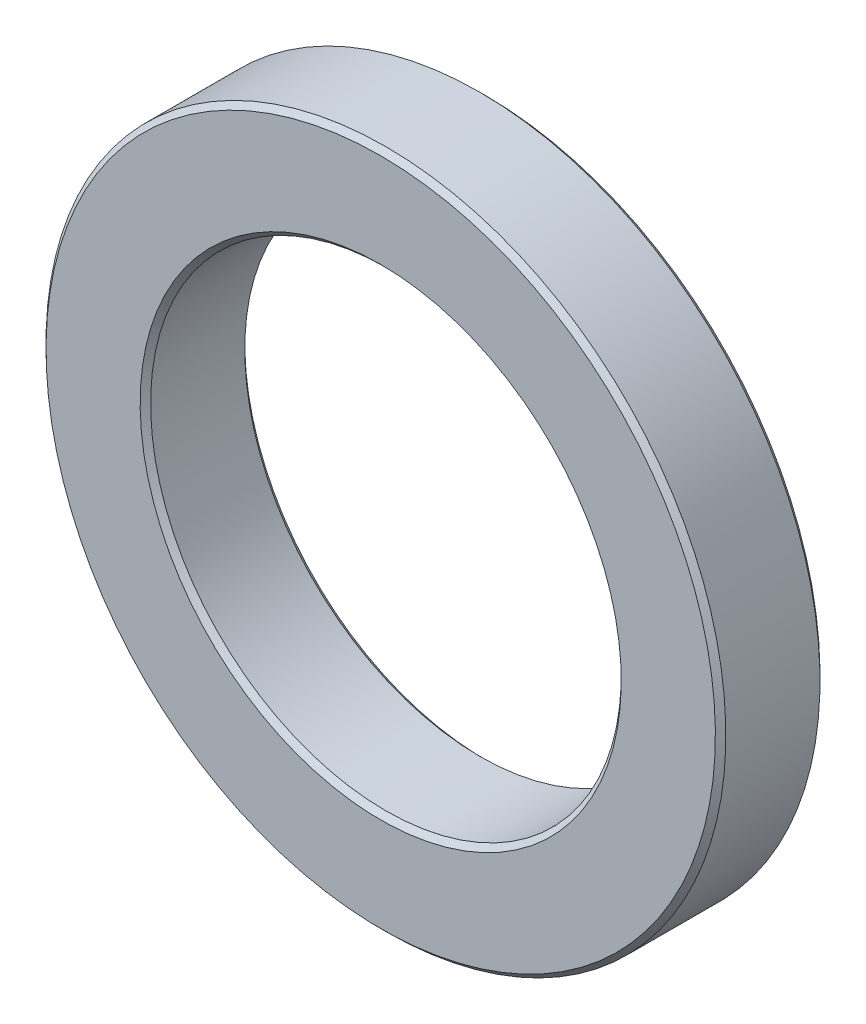
ISO-10303-21;
HEADER;
FILE_DESCRIPTION(('STEP AP214'),'2;1');
FILE_NAME('part.step','',(''),(''),'','','');
FILE_SCHEMA(('AUTOMOTIVE_DESIGN { 1 0 10303 214 1 1 1 1 }'));
ENDSEC;
DATA;
#1=APPLICATION_CONTEXT('core data for automotive mechanical design processes');
#2=APPLICATION_PROTOCOL_DEFINITION('international standard','automotive_design',2000,#1);
#3=PRODUCT_CONTEXT('',#1,'mechanical');
#4=PRODUCT('Part','Part','',(#3));
#5=PRODUCT_RELATED_PRODUCT_CATEGORY('part','',(#4));
#6=PRODUCT_DEFINITION_FORMATION('','',#4);
#7=PRODUCT_DEFINITION_CONTEXT('part definition',#1,'design');
#8=PRODUCT_DEFINITION('design','',#6,#7);
#9=PRODUCT_DEFINITION_SHAPE('','',#8);
#10=(LENGTH_UNIT() NAMED_UNIT(*) SI_UNIT(.MILLI.,.METRE.));
#11=(NAMED_UNIT(*) PLANE_ANGLE_UNIT() SI_UNIT($,.RADIAN.));
#12=(NAMED_UNIT(*) SI_UNIT($,.STERADIAN.) SOLID_ANGLE_UNIT());
#13=UNCERTAINTY_MEASURE_WITH_UNIT(LENGTH_MEASURE(1.E-05),#10,'distance_accuracy_value','');
#14=(GEOMETRIC_REPRESENTATION_CONTEXT(3) GLOBAL_UNCERTAINTY_ASSIGNED_CONTEXT((#13)) GLOBAL_UNIT_ASSIGNED_CONTEXT((#10,
#11,#12)) REPRESENTATION_CONTEXT('',''));
#15=CARTESIAN_POINT('',(0.,0.,0.));
#16=DIRECTION('',(0.,0.,1.));
#17=DIRECTION('',(1.,0.,0.));
#18=AXIS2_PLACEMENT_3D('',#15,#16,#17);
#19=CARTESIAN_POINT('',(0.,0.,0.));
#20=DIRECTION('',(0.,0.,-1.));
#21=DIRECTION('',(0.,1.,0.));
#22=AXIS2_PLACEMENT_3D('',#19,#20,#21);
#23=CYLINDRICAL_SURFACE('',#22,32.5);
#24=CARTESIAN_POINT('',(0.,0.,9.63751027496663));
#25=DIRECTION('',(0.,0.,-1.));
#26=DIRECTION('',(0.,1.,0.));
#27=AXIS2_PLACEMENT_3D('',#24,#25,#26);
#28=CIRCLE('',#27,32.5);
#29=CARTESIAN_POINT('',(0.,32.5,9.63751027496664));
#30=VERTEX_POINT('',#29);
#31=EDGE_CURVE('E72',#30,#30,#28,.T.);
#32=ORIENTED_EDGE('',*,*,#31,.T.);
#33=EDGE_LOOP('',(#32));
#34=FACE_BOUND('',#33,.T.);
#35=CARTESIAN_POINT('',(0.,0.,0.637510274966629));
#36=DIRECTION('',(0.,0.,-1.));
#37=DIRECTION('',(0.,1.,0.));
#38=AXIS2_PLACEMENT_3D('',#35,#36,#37);
#39=CIRCLE('',#38,32.5);
#40=CARTESIAN_POINT('',(0.,32.5,0.637510274966633));
#41=VERTEX_POINT('',#40);
#42=EDGE_CURVE('E10',#41,#41,#39,.T.);
#43=ORIENTED_EDGE('',*,*,#42,.F.);
#44=EDGE_LOOP('',(#43));
#45=FACE_BOUND('',#44,.T.);
#46=ADVANCED_FACE('F37',(#34,#45),#23,.T.);
#47=CARTESIAN_POINT('',(0.,0.,0.137510274966631));
#48=DIRECTION('',(0.,0.,1.));
#49=DIRECTION('',(0.,-1.,0.));
#50=AXIS2_PLACEMENT_3D('',#47,#48,#49);
#51=CONICAL_SURFACE('',#50,32.,0.785398163397451);
#52=ORIENTED_EDGE('',*,*,#42,.T.);
#53=EDGE_LOOP('',(#52));
#54=FACE_BOUND('',#53,.T.);
#55=CARTESIAN_POINT('',(0.,0.,0.137510274966631));
#56=DIRECTION('',(0.,0.,-1.));
#57=DIRECTION('',(0.,1.,0.));
#58=AXIS2_PLACEMENT_3D('',#55,#56,#57);
#59=CIRCLE('',#58,32.);
#60=CARTESIAN_POINT('',(0.,32.,0.137510274966635));
#61=VERTEX_POINT('',#60);
#62=EDGE_CURVE('E44',#61,#61,#59,.T.);
#63=ORIENTED_EDGE('',*,*,#62,.F.);
#64=EDGE_LOOP('',(#63));
#65=FACE_BOUND('',#64,.T.);
#66=ADVANCED_FACE('F91',(#54,#65),#51,.T.);
#67=CARTESIAN_POINT('',(0.,23.,0.137510274966634));
#68=DIRECTION('',(0.,0.,-1.));
#69=DIRECTION('',(0.,1.,0.));
#70=AXIS2_PLACEMENT_3D('',#67,#68,#69);
#71=PLANE('',#70);
#72=ORIENTED_EDGE('',*,*,#62,.T.);
#73=EDGE_LOOP('',(#72));
#74=FACE_BOUND('',#73,.T.);
#75=CARTESIAN_POINT('',(0.,0.,0.137510274966632));
#76=DIRECTION('',(0.,0.,-1.));
#77=DIRECTION('',(0.,1.,0.));
#78=AXIS2_PLACEMENT_3D('',#75,#76,#77);
#79=CIRCLE('',#78,23.);
#80=CARTESIAN_POINT('',(0.,23.,0.137510274966635));
#81=VERTEX_POINT('',#80);
#82=EDGE_CURVE('E49',#81,#81,#79,.T.);
#83=ORIENTED_EDGE('',*,*,#82,.F.);
#84=EDGE_LOOP('',(#83));
#85=FACE_BOUND('',#84,.T.);
#86=ADVANCED_FACE('F95',(#74,#85),#71,.T.);
#87=CARTESIAN_POINT('',(0.,0.,0.637510274966632));
#88=DIRECTION('',(0.,0.,-1.));
#89=DIRECTION('',(0.,1.,0.));
#90=AXIS2_PLACEMENT_3D('',#87,#88,#89);
#91=CONICAL_SURFACE('',#90,22.5,0.785398163397445);
#92=ORIENTED_EDGE('',*,*,#82,.T.);
#93=EDGE_LOOP('',(#92));
#94=FACE_BOUND('',#93,.T.);
#95=CARTESIAN_POINT('',(0.,0.,0.637510274966632));
#96=DIRECTION('',(0.,0.,-1.));
#97=DIRECTION('',(0.,1.,0.));
#98=AXIS2_PLACEMENT_3D('',#95,#96,#97);
#99=CIRCLE('',#98,22.5);
#100=CARTESIAN_POINT('',(0.,22.5,0.637510274966635));
#101=VERTEX_POINT('',#100);
#102=EDGE_CURVE('E54',#101,#101,#99,.T.);
#103=ORIENTED_EDGE('',*,*,#102,.F.);
#104=EDGE_LOOP('',(#103));
#105=FACE_BOUND('',#104,.T.);
#106=ADVANCED_FACE('F99',(#94,#105),#91,.F.);
#107=CARTESIAN_POINT('',(0.,0.,0.));
#108=DIRECTION('',(0.,0.,-1.));
#109=DIRECTION('',(0.,1.,0.));
#110=AXIS2_PLACEMENT_3D('',#107,#108,#109);
#111=CYLINDRICAL_SURFACE('',#110,22.5);
#112=ORIENTED_EDGE('',*,*,#102,.T.);
#113=EDGE_LOOP('',(#112));
#114=FACE_BOUND('',#113,.T.);
#115=CARTESIAN_POINT('',(0.,0.,9.63751027496663));
#116=DIRECTION('',(0.,0.,-1.));
#117=DIRECTION('',(0.,1.,0.));
#118=AXIS2_PLACEMENT_3D('',#115,#116,#117);
#119=CIRCLE('',#118,22.5);
#120=CARTESIAN_POINT('',(0.,22.5,9.63751027496664));
#121=VERTEX_POINT('',#120);
#122=EDGE_CURVE('E60',#121,#121,#119,.T.);
#123=ORIENTED_EDGE('',*,*,#122,.F.);
#124=EDGE_LOOP('',(#123));
#125=FACE_BOUND('',#124,.T.);
#126=ADVANCED_FACE('F105',(#114,#125),#111,.F.);
#127=CARTESIAN_POINT('',(0.,0.,10.1375102749666));
#128=DIRECTION('',(0.,0.,1.));
#129=DIRECTION('',(0.,-1.,0.));
#130=AXIS2_PLACEMENT_3D('',#127,#128,#129);
#131=CONICAL_SURFACE('',#130,23.,0.785398163397438);
#132=ORIENTED_EDGE('',*,*,#122,.T.);
#133=EDGE_LOOP('',(#132));
#134=FACE_BOUND('',#133,.T.);
#135=CARTESIAN_POINT('',(0.,0.,10.1375102749666));
#136=DIRECTION('',(0.,0.,-1.));
#137=DIRECTION('',(0.,1.,0.));
#138=AXIS2_PLACEMENT_3D('',#135,#136,#137);
#139=CIRCLE('',#138,23.);
#140=CARTESIAN_POINT('',(0.,23.,10.1375102749666));
#141=VERTEX_POINT('',#140);
#142=EDGE_CURVE('E64',#141,#141,#139,.T.);
#143=ORIENTED_EDGE('',*,*,#142,.F.);
#144=EDGE_LOOP('',(#143));
#145=FACE_BOUND('',#144,.T.);
#146=ADVANCED_FACE('F87',(#134,#145),#131,.F.);
#147=CARTESIAN_POINT('',(0.,23.,10.1375102749666));
#148=DIRECTION('',(0.,0.,1.));
#149=DIRECTION('',(0.,-1.,0.));
#150=AXIS2_PLACEMENT_3D('',#147,#148,#149);
#151=PLANE('',#150);
#152=ORIENTED_EDGE('',*,*,#142,.T.);
#153=EDGE_LOOP('',(#152));
#154=FACE_BOUND('',#153,.T.);
#155=CARTESIAN_POINT('',(0.,0.,10.1375102749666));
#156=DIRECTION('',(0.,0.,-1.));
#157=DIRECTION('',(0.,1.,0.));
#158=AXIS2_PLACEMENT_3D('',#155,#156,#157);
#159=CIRCLE('',#158,32.);
#160=CARTESIAN_POINT('',(0.,32.,10.1375102749666));
#161=VERTEX_POINT('',#160);
#162=EDGE_CURVE('E68',#161,#161,#159,.T.);
#163=ORIENTED_EDGE('',*,*,#162,.F.);
#164=EDGE_LOOP('',(#163));
#165=FACE_BOUND('',#164,.T.);
#166=ADVANCED_FACE('F81',(#154,#165),#151,.T.);
#167=CARTESIAN_POINT('',(0.,0.,9.63751027496663));
#168=DIRECTION('',(0.,0.,-1.));
#169=DIRECTION('',(0.,1.,0.));
#170=AXIS2_PLACEMENT_3D('',#167,#168,#169);
#171=CONICAL_SURFACE('',#170,32.5,0.785398163397448);
#172=ORIENTED_EDGE('',*,*,#162,.T.);
#173=EDGE_LOOP('',(#172));
#174=FACE_BOUND('',#173,.T.);
#175=ORIENTED_EDGE('',*,*,#31,.F.);
#176=EDGE_LOOP('',(#175));
#177=FACE_BOUND('',#176,.T.);
#178=ADVANCED_FACE('F79',(#174,#177),#171,.T.);
#179=CLOSED_SHELL('',(#46,#66,#86,#106,#126,#146,#166,#178));
#180=MANIFOLD_SOLID_BREP('B2',#179);
#181=ADVANCED_BREP_SHAPE_REPRESENTATION('',(#18,#180),#14);
#182=SHAPE_DEFINITION_REPRESENTATION(#9,#181);
ENDSEC;
END-ISO-10303-21;
